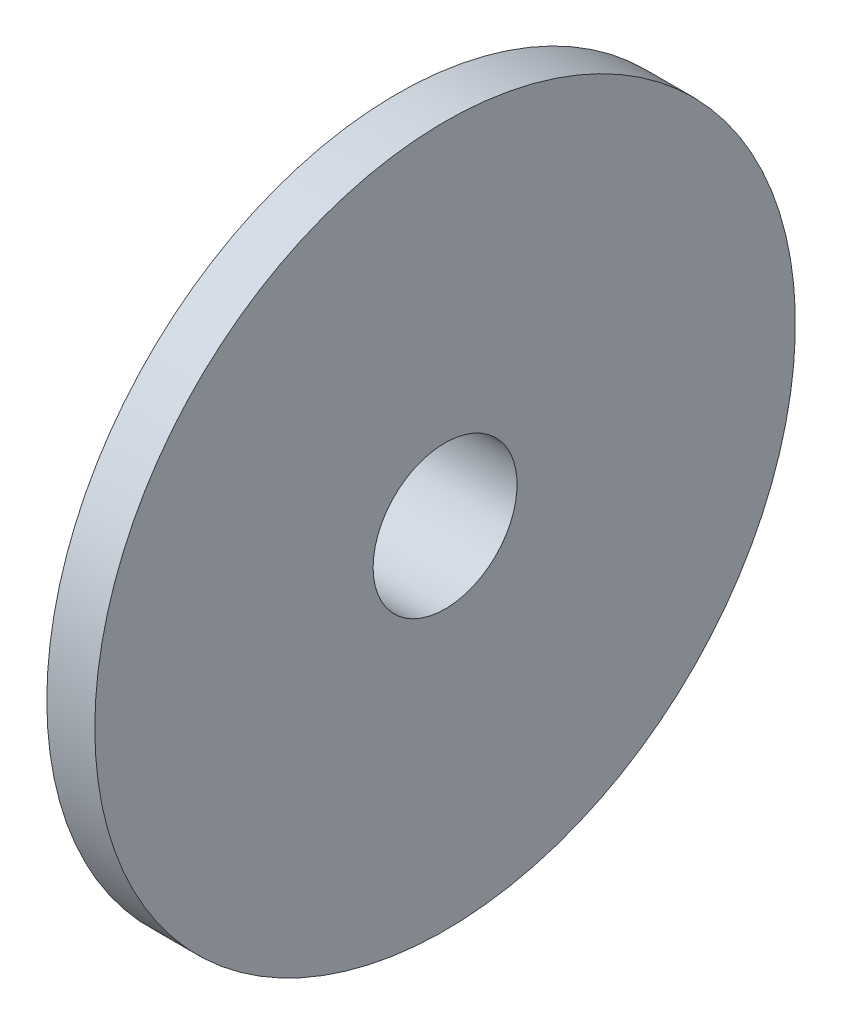
ISO-10303-21;
HEADER;
FILE_DESCRIPTION(('STEP AP214'),'2;1');
FILE_NAME('part.step','',(''),(''),'','','');
FILE_SCHEMA(('AUTOMOTIVE_DESIGN { 1 0 10303 214 1 1 1 1 }'));
ENDSEC;
DATA;
#1=APPLICATION_CONTEXT('core data for automotive mechanical design processes');
#2=APPLICATION_PROTOCOL_DEFINITION('international standard','automotive_design',2000,#1);
#3=PRODUCT_CONTEXT('',#1,'mechanical');
#4=PRODUCT('Part','Part','',(#3));
#5=PRODUCT_RELATED_PRODUCT_CATEGORY('part','',(#4));
#6=PRODUCT_DEFINITION_FORMATION('','',#4);
#7=PRODUCT_DEFINITION_CONTEXT('part definition',#1,'design');
#8=PRODUCT_DEFINITION('design','',#6,#7);
#9=PRODUCT_DEFINITION_SHAPE('','',#8);
#10=(LENGTH_UNIT() NAMED_UNIT(*) SI_UNIT(.MILLI.,.METRE.));
#11=(NAMED_UNIT(*) PLANE_ANGLE_UNIT() SI_UNIT($,.RADIAN.));
#12=(NAMED_UNIT(*) SI_UNIT($,.STERADIAN.) SOLID_ANGLE_UNIT());
#13=UNCERTAINTY_MEASURE_WITH_UNIT(LENGTH_MEASURE(1.E-05),#10,'distance_accuracy_value','');
#14=(GEOMETRIC_REPRESENTATION_CONTEXT(3) GLOBAL_UNCERTAINTY_ASSIGNED_CONTEXT((#13)) GLOBAL_UNIT_ASSIGNED_CONTEXT((#10,
#11,#12)) REPRESENTATION_CONTEXT('',''));
#15=CARTESIAN_POINT('',(0.,0.,0.));
#16=DIRECTION('',(0.,0.,1.));
#17=DIRECTION('',(1.,0.,0.));
#18=AXIS2_PLACEMENT_3D('',#15,#16,#17);
#19=CARTESIAN_POINT('',(-9.09999999999998,0.,0.));
#20=DIRECTION('',(-1.,0.,0.));
#21=DIRECTION('',(0.,0.,1.));
#22=AXIS2_PLACEMENT_3D('',#19,#20,#21);
#23=CYLINDRICAL_SURFACE('',#22,1.5);
#24=CARTESIAN_POINT('',(-2.8,0.,0.));
#25=DIRECTION('',(1.,0.,0.));
#26=DIRECTION('',(0.,0.,-1.));
#27=AXIS2_PLACEMENT_3D('',#24,#25,#26);
#28=CIRCLE('',#27,1.5);
#29=CARTESIAN_POINT('',(-2.8,0.,-1.5));
#30=VERTEX_POINT('',#29);
#31=EDGE_CURVE('E10',#30,#30,#28,.F.);
#32=ORIENTED_EDGE('',*,*,#31,.T.);
#33=EDGE_LOOP('',(#32));
#34=FACE_BOUND('',#33,.T.);
#35=CARTESIAN_POINT('',(0.,0.,0.));
#36=DIRECTION('',(-1.,0.,0.));
#37=DIRECTION('',(0.,0.,1.));
#38=AXIS2_PLACEMENT_3D('',#35,#36,#37);
#39=CIRCLE('',#38,1.5);
#40=CARTESIAN_POINT('',(0.,0.,1.5));
#41=VERTEX_POINT('',#40);
#42=EDGE_CURVE('E55',#41,#41,#39,.T.);
#43=ORIENTED_EDGE('',*,*,#42,.F.);
#44=EDGE_LOOP('',(#43));
#45=FACE_BOUND('',#44,.T.);
#46=ADVANCED_FACE('F35',(#34,#45),#23,.F.);
#47=CARTESIAN_POINT('',(0.,1.5,0.));
#48=DIRECTION('',(-1.,0.,0.));
#49=DIRECTION('',(0.,0.,1.));
#50=AXIS2_PLACEMENT_3D('',#47,#48,#49);
#51=PLANE('',#50);
#52=CARTESIAN_POINT('',(0.,0.,0.));
#53=DIRECTION('',(-1.,0.,0.));
#54=DIRECTION('',(0.,0.,1.));
#55=AXIS2_PLACEMENT_3D('',#52,#53,#54);
#56=CIRCLE('',#55,7.3);
#57=CARTESIAN_POINT('',(0.,0.,7.3));
#58=VERTEX_POINT('',#57);
#59=EDGE_CURVE('E58',#58,#58,#56,.T.);
#60=ORIENTED_EDGE('',*,*,#59,.F.);
#61=EDGE_LOOP('',(#60));
#62=FACE_BOUND('',#61,.T.);
#63=ORIENTED_EDGE('',*,*,#42,.T.);
#64=EDGE_LOOP('',(#63));
#65=FACE_BOUND('',#64,.T.);
#66=ADVANCED_FACE('F79',(#62,#65),#51,.F.);
#67=CARTESIAN_POINT('',(-9.09999999999998,0.,0.));
#68=DIRECTION('',(-1.,0.,0.));
#69=DIRECTION('',(0.,0.,1.));
#70=AXIS2_PLACEMENT_3D('',#67,#68,#69);
#71=CYLINDRICAL_SURFACE('',#70,7.3);
#72=CARTESIAN_POINT('',(-1.,0.,0.));
#73=DIRECTION('',(-1.,0.,0.));
#74=DIRECTION('',(0.,0.,1.));
#75=AXIS2_PLACEMENT_3D('',#72,#73,#74);
#76=CIRCLE('',#75,7.3);
#77=CARTESIAN_POINT('',(-1.,0.,7.3));
#78=VERTEX_POINT('',#77);
#79=EDGE_CURVE('E61',#78,#78,#76,.T.);
#80=ORIENTED_EDGE('',*,*,#79,.F.);
#81=EDGE_LOOP('',(#80));
#82=FACE_BOUND('',#81,.T.);
#83=ORIENTED_EDGE('',*,*,#59,.T.);
#84=EDGE_LOOP('',(#83));
#85=FACE_BOUND('',#84,.T.);
#86=ADVANCED_FACE('F73',(#82,#85),#71,.T.);
#87=CARTESIAN_POINT('',(-1.,7.3,0.));
#88=DIRECTION('',(1.,0.,0.));
#89=DIRECTION('',(0.,0.,-1.));
#90=AXIS2_PLACEMENT_3D('',#87,#88,#89);
#91=PLANE('',#90);
#92=CARTESIAN_POINT('',(-0.999999999999999,0.,0.));
#93=DIRECTION('',(-1.,0.,0.));
#94=DIRECTION('',(0.,0.,1.));
#95=AXIS2_PLACEMENT_3D('',#92,#93,#94);
#96=CIRCLE('',#95,2.75);
#97=CARTESIAN_POINT('',(-0.999999999999999,0.,2.75));
#98=VERTEX_POINT('',#97);
#99=EDGE_CURVE('E64',#98,#98,#96,.T.);
#100=ORIENTED_EDGE('',*,*,#99,.F.);
#101=EDGE_LOOP('',(#100));
#102=FACE_BOUND('',#101,.T.);
#103=ORIENTED_EDGE('',*,*,#79,.T.);
#104=EDGE_LOOP('',(#103));
#105=FACE_BOUND('',#104,.T.);
#106=ADVANCED_FACE('F70',(#102,#105),#91,.F.);
#107=CARTESIAN_POINT('',(-9.09999999999998,0.,0.));
#108=DIRECTION('',(-1.,0.,0.));
#109=DIRECTION('',(0.,0.,1.));
#110=AXIS2_PLACEMENT_3D('',#107,#108,#109);
#111=CYLINDRICAL_SURFACE('',#110,2.75);
#112=CARTESIAN_POINT('',(-2.8,0.,0.));
#113=DIRECTION('',(1.,0.,0.));
#114=DIRECTION('',(0.,0.,-1.));
#115=AXIS2_PLACEMENT_3D('',#112,#113,#114);
#116=CIRCLE('',#115,2.75);
#117=CARTESIAN_POINT('',(-2.8,0.,-2.75));
#118=VERTEX_POINT('',#117);
#119=EDGE_CURVE('E42',#118,#118,#116,.T.);
#120=ORIENTED_EDGE('',*,*,#119,.T.);
#121=EDGE_LOOP('',(#120));
#122=FACE_BOUND('',#121,.T.);
#123=ORIENTED_EDGE('',*,*,#99,.T.);
#124=EDGE_LOOP('',(#123));
#125=FACE_BOUND('',#124,.T.);
#126=ADVANCED_FACE('F68',(#122,#125),#111,.T.);
#127=CARTESIAN_POINT('',(-3.,2.75,0.));
#128=DIRECTION('',(1.,0.,0.));
#129=DIRECTION('',(0.,0.,-1.));
#130=AXIS2_PLACEMENT_3D('',#127,#128,#129);
#131=PLANE('',#130);
#132=CARTESIAN_POINT('',(-3.,0.,0.));
#133=DIRECTION('',(1.,0.,0.));
#134=DIRECTION('',(0.,0.,-1.));
#135=AXIS2_PLACEMENT_3D('',#132,#133,#134);
#136=CIRCLE('',#135,2.55);
#137=CARTESIAN_POINT('',(-3.,0.,-2.55));
#138=VERTEX_POINT('',#137);
#139=EDGE_CURVE('E46',#138,#138,#136,.F.);
#140=ORIENTED_EDGE('',*,*,#139,.T.);
#141=EDGE_LOOP('',(#140));
#142=FACE_BOUND('',#141,.T.);
#143=CARTESIAN_POINT('',(-3.,0.,0.));
#144=DIRECTION('',(1.,0.,0.));
#145=DIRECTION('',(0.,0.,-1.));
#146=AXIS2_PLACEMENT_3D('',#143,#144,#145);
#147=CIRCLE('',#146,1.7);
#148=CARTESIAN_POINT('',(-3.,0.,-1.7));
#149=VERTEX_POINT('',#148);
#150=EDGE_CURVE('E50',#149,#149,#147,.T.);
#151=ORIENTED_EDGE('',*,*,#150,.T.);
#152=EDGE_LOOP('',(#151));
#153=FACE_BOUND('',#152,.T.);
#154=ADVANCED_FACE('F94',(#142,#153),#131,.F.);
#155=CARTESIAN_POINT('',(-3.,0.,0.));
#156=DIRECTION('',(1.,0.,0.));
#157=DIRECTION('',(0.,0.,-1.));
#158=AXIS2_PLACEMENT_3D('',#155,#156,#157);
#159=CONICAL_SURFACE('',#158,2.55,0.785398163397446);
#160=ORIENTED_EDGE('',*,*,#119,.F.);
#161=EDGE_LOOP('',(#160));
#162=FACE_BOUND('',#161,.T.);
#163=ORIENTED_EDGE('',*,*,#139,.F.);
#164=EDGE_LOOP('',(#163));
#165=FACE_BOUND('',#164,.T.);
#166=ADVANCED_FACE('F92',(#162,#165),#159,.T.);
#167=CARTESIAN_POINT('',(-2.8,0.,0.));
#168=DIRECTION('',(-1.,0.,0.));
#169=DIRECTION('',(0.,0.,1.));
#170=AXIS2_PLACEMENT_3D('',#167,#168,#169);
#171=CONICAL_SURFACE('',#170,1.5,0.785398163397449);
#172=ORIENTED_EDGE('',*,*,#150,.F.);
#173=EDGE_LOOP('',(#172));
#174=FACE_BOUND('',#173,.T.);
#175=ORIENTED_EDGE('',*,*,#31,.F.);
#176=EDGE_LOOP('',(#175));
#177=FACE_BOUND('',#176,.T.);
#178=ADVANCED_FACE('F37',(#174,#177),#171,.F.);
#179=CLOSED_SHELL('',(#46,#66,#86,#106,#126,#154,#166,#178));
#180=MANIFOLD_SOLID_BREP('B2',#179);
#181=ADVANCED_BREP_SHAPE_REPRESENTATION('',(#18,#180),#14);
#182=SHAPE_DEFINITION_REPRESENTATION(#9,#181);
ENDSEC;
END-ISO-10303-21;
